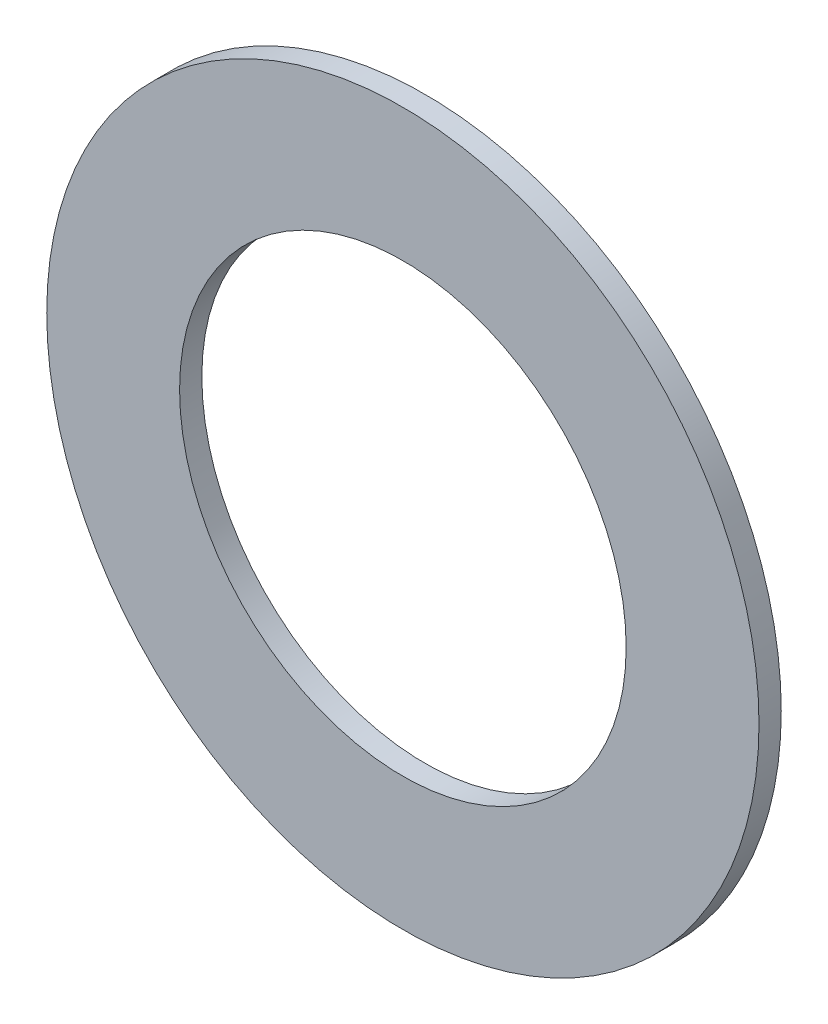
ISO-10303-21;
HEADER;
FILE_DESCRIPTION(('STEP AP214'),'2;1');
FILE_NAME('part.step','',(''),(''),'','','');
FILE_SCHEMA(('AUTOMOTIVE_DESIGN { 1 0 10303 214 1 1 1 1 }'));
ENDSEC;
DATA;
#1=APPLICATION_CONTEXT('core data for automotive mechanical design processes');
#2=APPLICATION_PROTOCOL_DEFINITION('international standard','automotive_design',2000,#1);
#3=PRODUCT_CONTEXT('',#1,'mechanical');
#4=PRODUCT('Part','Part','',(#3));
#5=PRODUCT_RELATED_PRODUCT_CATEGORY('part','',(#4));
#6=PRODUCT_DEFINITION_FORMATION('','',#4);
#7=PRODUCT_DEFINITION_CONTEXT('part definition',#1,'design');
#8=PRODUCT_DEFINITION('design','',#6,#7);
#9=PRODUCT_DEFINITION_SHAPE('','',#8);
#10=(LENGTH_UNIT() NAMED_UNIT(*) SI_UNIT(.MILLI.,.METRE.));
#11=(NAMED_UNIT(*) PLANE_ANGLE_UNIT() SI_UNIT($,.RADIAN.));
#12=(NAMED_UNIT(*) SI_UNIT($,.STERADIAN.) SOLID_ANGLE_UNIT());
#13=UNCERTAINTY_MEASURE_WITH_UNIT(LENGTH_MEASURE(1.E-05),#10,'distance_accuracy_value','');
#14=(GEOMETRIC_REPRESENTATION_CONTEXT(3) GLOBAL_UNCERTAINTY_ASSIGNED_CONTEXT((#13)) GLOBAL_UNIT_ASSIGNED_CONTEXT((#10,
#11,#12)) REPRESENTATION_CONTEXT('',''));
#15=CARTESIAN_POINT('',(0.,0.,0.));
#16=DIRECTION('',(0.,0.,1.));
#17=DIRECTION('',(1.,0.,0.));
#18=AXIS2_PLACEMENT_3D('',#15,#16,#17);
#19=CARTESIAN_POINT('',(0.,0.,0.79375));
#20=DIRECTION('',(0.,0.,1.));
#21=DIRECTION('',(1.,0.,0.));
#22=AXIS2_PLACEMENT_3D('',#19,#20,#21);
#23=PLANE('',#22);
#24=CARTESIAN_POINT('',(0.,0.,0.79375));
#25=DIRECTION('',(0.,0.,1.));
#26=DIRECTION('',(1.,0.,0.));
#27=AXIS2_PLACEMENT_3D('',#24,#25,#26);
#28=CIRCLE('',#27,25.4);
#29=CARTESIAN_POINT('',(25.4,0.,0.79375));
#30=VERTEX_POINT('',#29);
#31=EDGE_CURVE('E10',#30,#30,#28,.T.);
#32=ORIENTED_EDGE('',*,*,#31,.T.);
#33=EDGE_LOOP('',(#32));
#34=FACE_BOUND('',#33,.T.);
#35=CARTESIAN_POINT('',(0.,0.,0.79375));
#36=DIRECTION('',(0.,0.,1.));
#37=DIRECTION('',(1.,0.,0.));
#38=AXIS2_PLACEMENT_3D('',#35,#36,#37);
#39=CIRCLE('',#38,15.9258);
#40=CARTESIAN_POINT('',(15.9258,0.,0.79375));
#41=VERTEX_POINT('',#40);
#42=EDGE_CURVE('E41',#41,#41,#39,.T.);
#43=ORIENTED_EDGE('',*,*,#42,.F.);
#44=EDGE_LOOP('',(#43));
#45=FACE_BOUND('',#44,.T.);
#46=ADVANCED_FACE('F30',(#34,#45),#23,.T.);
#47=CARTESIAN_POINT('',(0.,0.,-0.79375));
#48=DIRECTION('',(0.,0.,1.));
#49=DIRECTION('',(1.,0.,0.));
#50=AXIS2_PLACEMENT_3D('',#47,#48,#49);
#51=PLANE('',#50);
#52=CARTESIAN_POINT('',(0.,0.,-0.79375));
#53=DIRECTION('',(0.,0.,1.));
#54=DIRECTION('',(1.,0.,0.));
#55=AXIS2_PLACEMENT_3D('',#52,#53,#54);
#56=CIRCLE('',#55,25.4);
#57=CARTESIAN_POINT('',(25.4,0.,-0.79375));
#58=VERTEX_POINT('',#57);
#59=EDGE_CURVE('E34',#58,#58,#56,.T.);
#60=ORIENTED_EDGE('',*,*,#59,.F.);
#61=EDGE_LOOP('',(#60));
#62=FACE_BOUND('',#61,.T.);
#63=CARTESIAN_POINT('',(0.,0.,-0.79375));
#64=DIRECTION('',(0.,0.,1.));
#65=DIRECTION('',(1.,0.,0.));
#66=AXIS2_PLACEMENT_3D('',#63,#64,#65);
#67=CIRCLE('',#66,15.9258);
#68=CARTESIAN_POINT('',(15.9258,0.,-0.79375));
#69=VERTEX_POINT('',#68);
#70=EDGE_CURVE('E43',#69,#69,#67,.T.);
#71=ORIENTED_EDGE('',*,*,#70,.T.);
#72=EDGE_LOOP('',(#71));
#73=FACE_BOUND('',#72,.T.);
#74=ADVANCED_FACE('F53',(#62,#73),#51,.F.);
#75=CARTESIAN_POINT('',(0.,0.,0.79375));
#76=DIRECTION('',(0.,0.,-1.));
#77=DIRECTION('',(-1.,0.,0.));
#78=AXIS2_PLACEMENT_3D('',#75,#76,#77);
#79=CYLINDRICAL_SURFACE('',#78,25.4);
#80=ORIENTED_EDGE('',*,*,#31,.F.);
#81=EDGE_LOOP('',(#80));
#82=FACE_BOUND('',#81,.T.);
#83=ORIENTED_EDGE('',*,*,#59,.T.);
#84=EDGE_LOOP('',(#83));
#85=FACE_BOUND('',#84,.T.);
#86=ADVANCED_FACE('F32',(#82,#85),#79,.T.);
#87=CARTESIAN_POINT('',(0.,0.,0.79375));
#88=DIRECTION('',(0.,0.,-1.));
#89=DIRECTION('',(-1.,0.,0.));
#90=AXIS2_PLACEMENT_3D('',#87,#88,#89);
#91=CYLINDRICAL_SURFACE('',#90,15.9258);
#92=ORIENTED_EDGE('',*,*,#42,.T.);
#93=EDGE_LOOP('',(#92));
#94=FACE_BOUND('',#93,.T.);
#95=ORIENTED_EDGE('',*,*,#70,.F.);
#96=EDGE_LOOP('',(#95));
#97=FACE_BOUND('',#96,.T.);
#98=ADVANCED_FACE('F49',(#94,#97),#91,.F.);
#99=CLOSED_SHELL('',(#46,#74,#86,#98));
#100=MANIFOLD_SOLID_BREP('B2',#99);
#101=ADVANCED_BREP_SHAPE_REPRESENTATION('',(#18,#100),#14);
#102=SHAPE_DEFINITION_REPRESENTATION(#9,#101);
ENDSEC;
END-ISO-10303-21;
